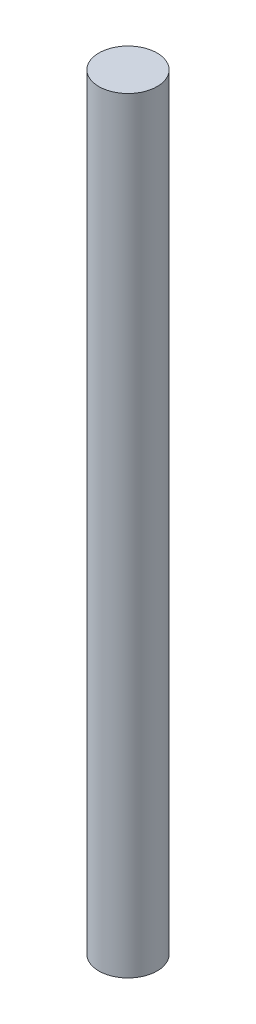
ISO-10303-21;
HEADER;
FILE_DESCRIPTION(('STEP AP214'),'2;1');
FILE_NAME('part.step','',(''),(''),'','','');
FILE_SCHEMA(('AUTOMOTIVE_DESIGN { 1 0 10303 214 1 1 1 1 }'));
ENDSEC;
DATA;
#1=APPLICATION_CONTEXT('core data for automotive mechanical design processes');
#2=APPLICATION_PROTOCOL_DEFINITION('international standard','automotive_design',2000,#1);
#3=PRODUCT_CONTEXT('',#1,'mechanical');
#4=PRODUCT('Part','Part','',(#3));
#5=PRODUCT_RELATED_PRODUCT_CATEGORY('part','',(#4));
#6=PRODUCT_DEFINITION_FORMATION('','',#4);
#7=PRODUCT_DEFINITION_CONTEXT('part definition',#1,'design');
#8=PRODUCT_DEFINITION('design','',#6,#7);
#9=PRODUCT_DEFINITION_SHAPE('','',#8);
#10=(LENGTH_UNIT() NAMED_UNIT(*) SI_UNIT(.MILLI.,.METRE.));
#11=(NAMED_UNIT(*) PLANE_ANGLE_UNIT() SI_UNIT($,.RADIAN.));
#12=(NAMED_UNIT(*) SI_UNIT($,.STERADIAN.) SOLID_ANGLE_UNIT());
#13=UNCERTAINTY_MEASURE_WITH_UNIT(LENGTH_MEASURE(1.E-05),#10,'distance_accuracy_value','');
#14=(GEOMETRIC_REPRESENTATION_CONTEXT(3) GLOBAL_UNCERTAINTY_ASSIGNED_CONTEXT((#13)) GLOBAL_UNIT_ASSIGNED_CONTEXT((#10,
#11,#12)) REPRESENTATION_CONTEXT('',''));
#15=CARTESIAN_POINT('',(0.,0.,0.));
#16=DIRECTION('',(0.,0.,1.));
#17=DIRECTION('',(1.,0.,0.));
#18=AXIS2_PLACEMENT_3D('',#15,#16,#17);
#19=CARTESIAN_POINT('',(0.,25.,0.));
#20=DIRECTION('',(0.,-1.,0.));
#21=DIRECTION('',(0.,0.,-1.));
#22=AXIS2_PLACEMENT_3D('',#19,#20,#21);
#23=CYLINDRICAL_SURFACE('',#22,0.95);
#24=CARTESIAN_POINT('',(0.,25.,0.));
#25=DIRECTION('',(0.,1.,0.));
#26=DIRECTION('',(0.,0.,1.));
#27=AXIS2_PLACEMENT_3D('',#24,#25,#26);
#28=CIRCLE('',#27,0.95);
#29=CARTESIAN_POINT('',(0.,25.,0.95));
#30=VERTEX_POINT('',#29);
#31=EDGE_CURVE('E10',#30,#30,#28,.T.);
#32=ORIENTED_EDGE('',*,*,#31,.F.);
#33=EDGE_LOOP('',(#32));
#34=FACE_BOUND('',#33,.T.);
#35=CARTESIAN_POINT('',(0.,0.,0.));
#36=DIRECTION('',(0.,1.,0.));
#37=DIRECTION('',(0.,0.,1.));
#38=AXIS2_PLACEMENT_3D('',#35,#36,#37);
#39=CIRCLE('',#38,0.95);
#40=CARTESIAN_POINT('',(0.,0.,0.95));
#41=VERTEX_POINT('',#40);
#42=EDGE_CURVE('E35',#41,#41,#39,.T.);
#43=ORIENTED_EDGE('',*,*,#42,.T.);
#44=EDGE_LOOP('',(#43));
#45=FACE_BOUND('',#44,.T.);
#46=ADVANCED_FACE('F32',(#34,#45),#23,.T.);
#47=CARTESIAN_POINT('',(0.,25.,0.));
#48=DIRECTION('',(0.,1.,0.));
#49=DIRECTION('',(0.,0.,1.));
#50=AXIS2_PLACEMENT_3D('',#47,#48,#49);
#51=PLANE('',#50);
#52=ORIENTED_EDGE('',*,*,#31,.T.);
#53=EDGE_LOOP('',(#52));
#54=FACE_BOUND('',#53,.T.);
#55=ADVANCED_FACE('F47',(#54),#51,.T.);
#56=CARTESIAN_POINT('',(0.,0.,0.));
#57=DIRECTION('',(0.,1.,0.));
#58=DIRECTION('',(0.,0.,1.));
#59=AXIS2_PLACEMENT_3D('',#56,#57,#58);
#60=PLANE('',#59);
#61=ORIENTED_EDGE('',*,*,#42,.F.);
#62=EDGE_LOOP('',(#61));
#63=FACE_BOUND('',#62,.T.);
#64=ADVANCED_FACE('F45',(#63),#60,.F.);
#65=CLOSED_SHELL('',(#46,#55,#64));
#66=MANIFOLD_SOLID_BREP('B2',#65);
#67=ADVANCED_BREP_SHAPE_REPRESENTATION('',(#18,#66),#14);
#68=SHAPE_DEFINITION_REPRESENTATION(#9,#67);
ENDSEC;
END-ISO-10303-21;
